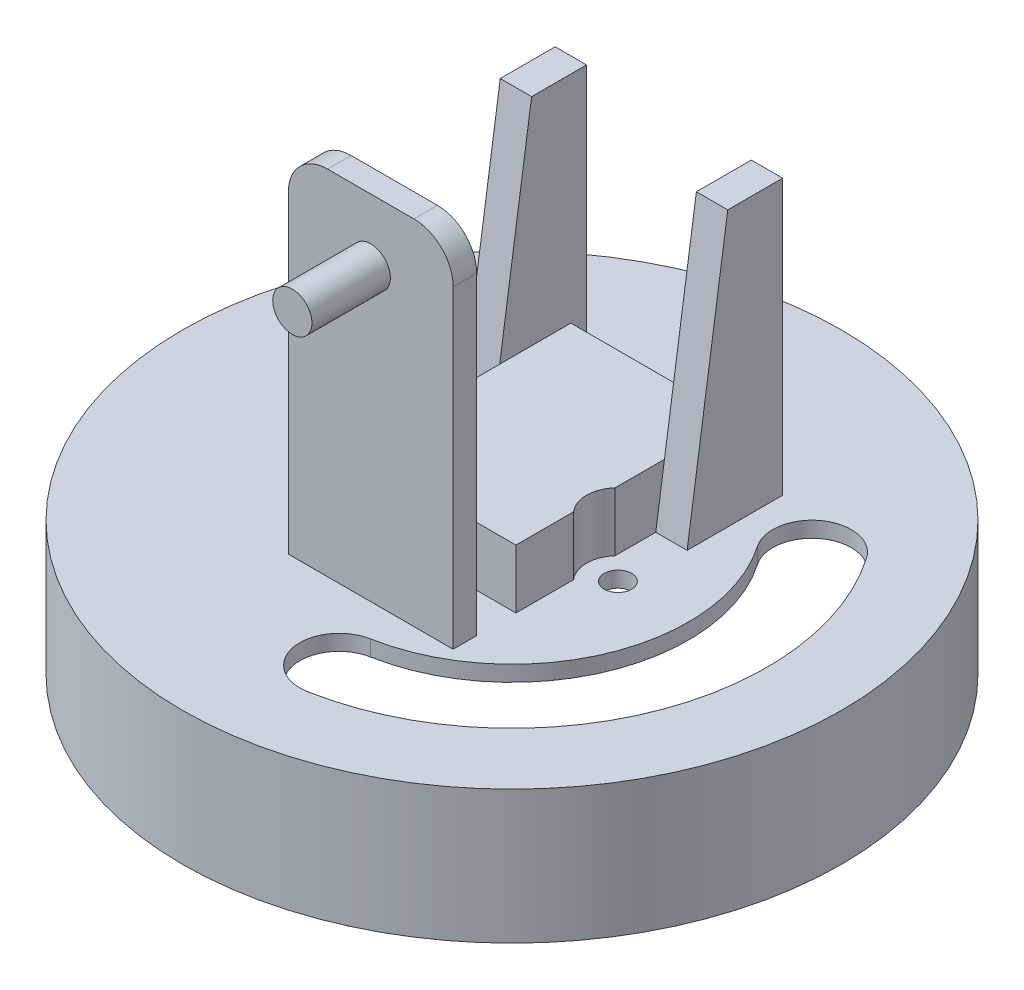
ISO-10303-21;
HEADER;
FILE_DESCRIPTION(('STEP AP214'),'2;1');
FILE_NAME('part.step','',(''),(''),'','','');
FILE_SCHEMA(('AUTOMOTIVE_DESIGN { 1 0 10303 214 1 1 1 1 }'));
ENDSEC;
DATA;
#1=APPLICATION_CONTEXT('core data for automotive mechanical design processes');
#2=APPLICATION_PROTOCOL_DEFINITION('international standard','automotive_design',2000,#1);
#3=PRODUCT_CONTEXT('',#1,'mechanical');
#4=PRODUCT('Part','Part','',(#3));
#5=PRODUCT_RELATED_PRODUCT_CATEGORY('part','',(#4));
#6=PRODUCT_DEFINITION_FORMATION('','',#4);
#7=PRODUCT_DEFINITION_CONTEXT('part definition',#1,'design');
#8=PRODUCT_DEFINITION('design','',#6,#7);
#9=PRODUCT_DEFINITION_SHAPE('','',#8);
#10=(LENGTH_UNIT() NAMED_UNIT(*) SI_UNIT(.MILLI.,.METRE.));
#11=(NAMED_UNIT(*) PLANE_ANGLE_UNIT() SI_UNIT($,.RADIAN.));
#12=(NAMED_UNIT(*) SI_UNIT($,.STERADIAN.) SOLID_ANGLE_UNIT());
#13=UNCERTAINTY_MEASURE_WITH_UNIT(LENGTH_MEASURE(1.E-05),#10,'distance_accuracy_value','');
#14=(GEOMETRIC_REPRESENTATION_CONTEXT(3) GLOBAL_UNCERTAINTY_ASSIGNED_CONTEXT((#13)) GLOBAL_UNIT_ASSIGNED_CONTEXT((#10,
#11,#12)) REPRESENTATION_CONTEXT('',''));
#15=CARTESIAN_POINT('',(0.,0.,0.));
#16=DIRECTION('',(0.,0.,1.));
#17=DIRECTION('',(1.,0.,0.));
#18=AXIS2_PLACEMENT_3D('',#15,#16,#17);
#19=CARTESIAN_POINT('',(0.,17.,0.));
#20=DIRECTION('',(0.,1.,0.));
#21=DIRECTION('',(0.,0.,1.));
#22=AXIS2_PLACEMENT_3D('',#19,#20,#21);
#23=PLANE('',#22);
#24=CARTESIAN_POINT('',(-13.5,17.,0.));
#25=DIRECTION('',(0.,1.,0.));
#26=DIRECTION('',(0.,0.,1.));
#27=AXIS2_PLACEMENT_3D('',#24,#25,#26);
#28=CIRCLE('',#27,1.75);
#29=CARTESIAN_POINT('',(-13.5,17.,1.75));
#30=VERTEX_POINT('',#29);
#31=EDGE_CURVE('E409',#30,#30,#28,.T.);
#32=ORIENTED_EDGE('',*,*,#31,.F.);
#33=EDGE_LOOP('',(#32));
#34=FACE_BOUND('',#33,.T.);
#35=CARTESIAN_POINT('',(13.5,17.,0.));
#36=DIRECTION('',(0.,1.,0.));
#37=DIRECTION('',(0.,0.,1.));
#38=AXIS2_PLACEMENT_3D('',#35,#36,#37);
#39=CIRCLE('',#38,1.75);
#40=CARTESIAN_POINT('',(13.5,17.,1.75));
#41=VERTEX_POINT('',#40);
#42=EDGE_CURVE('E398',#41,#41,#39,.T.);
#43=ORIENTED_EDGE('',*,*,#42,.F.);
#44=EDGE_LOOP('',(#43));
#45=FACE_BOUND('',#44,.T.);
#46=CARTESIAN_POINT('',(0.,17.,0.));
#47=DIRECTION('',(0.,1.,0.));
#48=DIRECTION('',(0.,0.,1.));
#49=AXIS2_PLACEMENT_3D('',#46,#47,#48);
#50=CIRCLE('',#49,42.);
#51=CARTESIAN_POINT('',(0.,17.,42.));
#52=VERTEX_POINT('',#51);
#53=EDGE_CURVE('E408',#52,#52,#50,.T.);
#54=ORIENTED_EDGE('',*,*,#53,.T.);
#55=EDGE_LOOP('',(#54));
#56=FACE_BOUND('',#55,.T.);
#57=CARTESIAN_POINT('',(0.,17.,0.));
#58=DIRECTION('',(0.,1.,0.));
#59=DIRECTION('',(0.,0.,1.));
#60=AXIS2_PLACEMENT_3D('',#57,#58,#59);
#61=CIRCLE('',#60,22.5);
#62=CARTESIAN_POINT('',(4.09090909090909,17.,22.1249737358017));
#63=VERTEX_POINT('',#62);
#64=CARTESIAN_POINT('',(18.5374285215592,17.,-12.7520094027602));
#65=VERTEX_POINT('',#64);
#66=EDGE_CURVE('E388',#63,#65,#61,.T.);
#67=ORIENTED_EDGE('',*,*,#66,.T.);
#68=CARTESIAN_POINT('',(22.6568570819057,17.,-15.5857892700402));
#69=DIRECTION('',(0.,1.,0.));
#70=DIRECTION('',(0.,0.,1.));
#71=AXIS2_PLACEMENT_3D('',#68,#69,#70);
#72=CIRCLE('',#71,5.);
#73=CARTESIAN_POINT('',(26.7762856422522,17.,-18.4195691373203));
#74=VERTEX_POINT('',#73);
#75=EDGE_CURVE('E373',#65,#74,#72,.F.);
#76=ORIENTED_EDGE('',*,*,#75,.T.);
#77=CARTESIAN_POINT('',(0.,17.,0.));
#78=DIRECTION('',(0.,1.,0.));
#79=DIRECTION('',(0.,0.,1.));
#80=AXIS2_PLACEMENT_3D('',#77,#78,#79);
#81=CIRCLE('',#80,32.5);
#82=CARTESIAN_POINT('',(5.90909090909091,17.,31.9582953961581));
#83=VERTEX_POINT('',#82);
#84=EDGE_CURVE('E377',#83,#74,#81,.T.);
#85=ORIENTED_EDGE('',*,*,#84,.F.);
#86=CARTESIAN_POINT('',(5.,17.,27.0416345659799));
#87=DIRECTION('',(0.,1.,0.));
#88=DIRECTION('',(0.,0.,1.));
#89=AXIS2_PLACEMENT_3D('',#86,#87,#88);
#90=CIRCLE('',#89,5.);
#91=EDGE_CURVE('E391',#83,#63,#90,.F.);
#92=ORIENTED_EDGE('',*,*,#91,.T.);
#93=EDGE_LOOP('',(#67,#76,#85,#92));
#94=FACE_BOUND('',#93,.T.);
#95=DIRECTION('',(0.,0.,1.));
#96=VECTOR('',#95,1.);
#97=CARTESIAN_POINT('',(-10.5,17.,-2.64575131106459));
#98=LINE('',#97,#96);
#99=CARTESIAN_POINT('',(-10.5,17.,-7.8228756555323));
#100=VERTEX_POINT('',#99);
#101=CARTESIAN_POINT('',(-10.5,17.,-2.64575131106459));
#102=VERTEX_POINT('',#101);
#103=EDGE_CURVE('E345',#100,#102,#98,.T.);
#104=ORIENTED_EDGE('',*,*,#103,.F.);
#105=DIRECTION('',(1.,0.,0.));
#106=VECTOR('',#105,1.);
#107=CARTESIAN_POINT('',(-14.5,17.,-7.8228756555323));
#108=LINE('',#107,#106);
#109=CARTESIAN_POINT('',(-14.5,17.,-7.8228756555323));
#110=VERTEX_POINT('',#109);
#111=EDGE_CURVE('E250',#110,#100,#108,.T.);
#112=ORIENTED_EDGE('',*,*,#111,.F.);
#113=DIRECTION('',(0.,0.,1.));
#114=VECTOR('',#113,1.);
#115=CARTESIAN_POINT('',(-14.5,17.,-13.));
#116=LINE('',#115,#114);
#117=CARTESIAN_POINT('',(-14.5,17.,-20.));
#118=VERTEX_POINT('',#117);
#119=EDGE_CURVE('E303',#118,#110,#116,.T.);
#120=ORIENTED_EDGE('',*,*,#119,.F.);
#121=DIRECTION('',(-1.,0.,0.));
#122=VECTOR('',#121,1.);
#123=CARTESIAN_POINT('',(-14.5,17.,-20.));
#124=LINE('',#123,#122);
#125=CARTESIAN_POINT('',(-10.5,17.,-20.));
#126=VERTEX_POINT('',#125);
#127=EDGE_CURVE('E288',#126,#118,#124,.T.);
#128=ORIENTED_EDGE('',*,*,#127,.F.);
#129=DIRECTION('',(0.,0.,-1.));
#130=VECTOR('',#129,1.);
#131=CARTESIAN_POINT('',(-10.5,17.,-18.));
#132=LINE('',#131,#130);
#133=CARTESIAN_POINT('',(-10.5,17.,-18.));
#134=VERTEX_POINT('',#133);
#135=EDGE_CURVE('E293',#134,#126,#132,.T.);
#136=ORIENTED_EDGE('',*,*,#135,.F.);
#137=DIRECTION('',(-1.,0.,0.));
#138=VECTOR('',#137,1.);
#139=CARTESIAN_POINT('',(-10.5,17.,-18.));
#140=LINE('',#139,#138);
#141=CARTESIAN_POINT('',(10.5,17.,-18.));
#142=VERTEX_POINT('',#141);
#143=EDGE_CURVE('E342',#142,#134,#140,.T.);
#144=ORIENTED_EDGE('',*,*,#143,.F.);
#145=DIRECTION('',(0.,0.,1.));
#146=VECTOR('',#145,1.);
#147=CARTESIAN_POINT('',(10.5,17.,-18.));
#148=LINE('',#147,#146);
#149=CARTESIAN_POINT('',(10.5,17.,-20.));
#150=VERTEX_POINT('',#149);
#151=EDGE_CURVE('E281',#150,#142,#148,.T.);
#152=ORIENTED_EDGE('',*,*,#151,.F.);
#153=DIRECTION('',(-1.,0.,0.));
#154=VECTOR('',#153,1.);
#155=CARTESIAN_POINT('',(14.5,17.,-20.));
#156=LINE('',#155,#154);
#157=CARTESIAN_POINT('',(14.5,17.,-20.));
#158=VERTEX_POINT('',#157);
#159=EDGE_CURVE('E265',#158,#150,#156,.T.);
#160=ORIENTED_EDGE('',*,*,#159,.F.);
#161=DIRECTION('',(0.,0.,-1.));
#162=VECTOR('',#161,1.);
#163=CARTESIAN_POINT('',(14.5,17.,-13.));
#164=LINE('',#163,#162);
#165=CARTESIAN_POINT('',(14.5,17.,-7.82287565553231));
#166=VERTEX_POINT('',#165);
#167=EDGE_CURVE('E270',#166,#158,#164,.T.);
#168=ORIENTED_EDGE('',*,*,#167,.F.);
#169=DIRECTION('',(-1.,0.,0.));
#170=VECTOR('',#169,1.);
#171=CARTESIAN_POINT('',(14.5,17.,-7.82287565553231));
#172=LINE('',#171,#170);
#173=CARTESIAN_POINT('',(10.5,17.,-7.82287565553231));
#174=VERTEX_POINT('',#173);
#175=EDGE_CURVE('E259',#166,#174,#172,.T.);
#176=ORIENTED_EDGE('',*,*,#175,.T.);
#177=DIRECTION('',(0.,0.,-1.));
#178=VECTOR('',#177,1.);
#179=CARTESIAN_POINT('',(10.5,17.,-18.));
#180=LINE('',#179,#178);
#181=CARTESIAN_POINT('',(10.5,17.,-2.64575131106459));
#182=VERTEX_POINT('',#181);
#183=EDGE_CURVE('E339',#182,#174,#180,.T.);
#184=ORIENTED_EDGE('',*,*,#183,.F.);
#185=CARTESIAN_POINT('',(13.5,17.,0.));
#186=DIRECTION('',(0.,-1.,0.));
#187=DIRECTION('',(0.,0.,1.));
#188=AXIS2_PLACEMENT_3D('',#185,#186,#187);
#189=CIRCLE('',#188,4.);
#190=CARTESIAN_POINT('',(10.5,17.,2.64575131106459));
#191=VERTEX_POINT('',#190);
#192=EDGE_CURVE('E337',#191,#182,#189,.T.);
#193=ORIENTED_EDGE('',*,*,#192,.F.);
#194=DIRECTION('',(0.,0.,-1.));
#195=VECTOR('',#194,1.);
#196=CARTESIAN_POINT('',(10.5,17.,2.64575131106459));
#197=LINE('',#196,#195);
#198=CARTESIAN_POINT('',(10.5,17.,10.));
#199=VERTEX_POINT('',#198);
#200=EDGE_CURVE('E311',#199,#191,#197,.T.);
#201=ORIENTED_EDGE('',*,*,#200,.F.);
#202=DIRECTION('',(1.,0.,0.));
#203=VECTOR('',#202,1.);
#204=CARTESIAN_POINT('',(-10.5,17.,10.));
#205=LINE('',#204,#203);
#206=CARTESIAN_POINT('',(-10.5,17.,10.));
#207=VERTEX_POINT('',#206);
#208=EDGE_CURVE('E316',#207,#199,#205,.T.);
#209=ORIENTED_EDGE('',*,*,#208,.F.);
#210=DIRECTION('',(0.,0.,1.));
#211=VECTOR('',#210,1.);
#212=CARTESIAN_POINT('',(-10.5,17.,10.));
#213=LINE('',#212,#211);
#214=CARTESIAN_POINT('',(-10.5,17.,2.64575131106459));
#215=VERTEX_POINT('',#214);
#216=EDGE_CURVE('E349',#215,#207,#213,.T.);
#217=ORIENTED_EDGE('',*,*,#216,.F.);
#218=CARTESIAN_POINT('',(-13.5,17.,0.));
#219=DIRECTION('',(0.,-1.,0.));
#220=DIRECTION('',(0.,0.,1.));
#221=AXIS2_PLACEMENT_3D('',#218,#219,#220);
#222=CIRCLE('',#221,4.);
#223=EDGE_CURVE('E347',#102,#215,#222,.T.);
#224=ORIENTED_EDGE('',*,*,#223,.F.);
#225=EDGE_LOOP('',(#104,#112,#120,#128,#136,#144,#152,#160,#168,#176,#184,#193,#201,#209,#217,#224));
#226=FACE_BOUND('',#225,.T.);
#227=DIRECTION('',(0.,0.,1.));
#228=VECTOR('',#227,1.);
#229=CARTESIAN_POINT('',(-10.5,17.,18.));
#230=LINE('',#229,#228);
#231=CARTESIAN_POINT('',(-10.5,17.,15.));
#232=VERTEX_POINT('',#231);
#233=CARTESIAN_POINT('',(-10.5,17.,18.));
#234=VERTEX_POINT('',#233);
#235=EDGE_CURVE('E216',#232,#234,#230,.T.);
#236=ORIENTED_EDGE('',*,*,#235,.F.);
#237=DIRECTION('',(-1.,0.,0.));
#238=VECTOR('',#237,1.);
#239=CARTESIAN_POINT('',(-10.5,17.,15.));
#240=LINE('',#239,#238);
#241=CARTESIAN_POINT('',(10.5,17.,15.));
#242=VERTEX_POINT('',#241);
#243=EDGE_CURVE('E225',#242,#232,#240,.T.);
#244=ORIENTED_EDGE('',*,*,#243,.F.);
#245=DIRECTION('',(0.,0.,-1.));
#246=VECTOR('',#245,1.);
#247=CARTESIAN_POINT('',(10.5,17.,15.));
#248=LINE('',#247,#246);
#249=CARTESIAN_POINT('',(10.5,17.,18.));
#250=VERTEX_POINT('',#249);
#251=EDGE_CURVE('E237',#250,#242,#248,.T.);
#252=ORIENTED_EDGE('',*,*,#251,.F.);
#253=DIRECTION('',(1.,0.,0.));
#254=VECTOR('',#253,1.);
#255=CARTESIAN_POINT('',(10.5,17.,18.));
#256=LINE('',#255,#254);
#257=EDGE_CURVE('E235',#234,#250,#256,.T.);
#258=ORIENTED_EDGE('',*,*,#257,.F.);
#259=EDGE_LOOP('',(#236,#244,#252,#258));
#260=FACE_BOUND('',#259,.T.);
#261=ADVANCED_FACE('F33',(#34,#45,#56,#94,#226,#260),#23,.T.);
#262=CARTESIAN_POINT('',(-10.5,24.5,-2.64575131106459));
#263=DIRECTION('',(1.,0.,0.));
#264=DIRECTION('',(0.,0.,-1.));
#265=AXIS2_PLACEMENT_3D('',#262,#263,#264);
#266=PLANE('',#265);
#267=DIRECTION('',(0.,0.989236465050933,-0.14632571959001));
#268=VECTOR('',#267,1.);
#269=CARTESIAN_POINT('',(-10.5,52.,-13.));
#270=LINE('',#269,#268);
#271=CARTESIAN_POINT('',(-10.5,24.5,-8.93225944363252));
#272=VERTEX_POINT('',#271);
#273=EDGE_CURVE('E251',#100,#272,#270,.T.);
#274=ORIENTED_EDGE('',*,*,#273,.F.);
#275=ORIENTED_EDGE('',*,*,#103,.T.);
#276=DIRECTION('',(0.,-1.,0.));
#277=VECTOR('',#276,1.);
#278=CARTESIAN_POINT('',(-10.5,24.5,-2.64575131106459));
#279=LINE('',#278,#277);
#280=CARTESIAN_POINT('',(-10.5,24.5,-2.64575131106459));
#281=VERTEX_POINT('',#280);
#282=EDGE_CURVE('E360',#281,#102,#279,.T.);
#283=ORIENTED_EDGE('',*,*,#282,.F.);
#284=DIRECTION('',(0.,0.,1.));
#285=VECTOR('',#284,1.);
#286=CARTESIAN_POINT('',(-10.5,24.5,-2.64575131106459));
#287=LINE('',#286,#285);
#288=EDGE_CURVE('E325',#272,#281,#287,.T.);
#289=ORIENTED_EDGE('',*,*,#288,.F.);
#290=EDGE_LOOP('',(#274,#275,#283,#289));
#291=FACE_BOUND('',#290,.T.);
#292=ADVANCED_FACE('F476',(#291),#266,.F.);
#293=CARTESIAN_POINT('',(10.5,24.5,-18.));
#294=DIRECTION('',(-1.,0.,0.));
#295=DIRECTION('',(0.,0.,1.));
#296=AXIS2_PLACEMENT_3D('',#293,#294,#295);
#297=PLANE('',#296);
#298=DIRECTION('',(0.,-0.989236465050933,0.146325719590011));
#299=VECTOR('',#298,1.);
#300=CARTESIAN_POINT('',(10.5,52.,-13.));
#301=LINE('',#300,#299);
#302=CARTESIAN_POINT('',(10.5,24.5,-8.93225944363254));
#303=VERTEX_POINT('',#302);
#304=EDGE_CURVE('E255',#303,#174,#301,.T.);
#305=ORIENTED_EDGE('',*,*,#304,.F.);
#306=DIRECTION('',(0.,0.,-1.));
#307=VECTOR('',#306,1.);
#308=CARTESIAN_POINT('',(10.5,24.5,-18.));
#309=LINE('',#308,#307);
#310=CARTESIAN_POINT('',(10.5,24.5,-2.64575131106459));
#311=VERTEX_POINT('',#310);
#312=EDGE_CURVE('E319',#311,#303,#309,.T.);
#313=ORIENTED_EDGE('',*,*,#312,.F.);
#314=DIRECTION('',(0.,-1.,0.));
#315=VECTOR('',#314,1.);
#316=CARTESIAN_POINT('',(10.5,24.5,-2.64575131106459));
#317=LINE('',#316,#315);
#318=EDGE_CURVE('E368',#311,#182,#317,.T.);
#319=ORIENTED_EDGE('',*,*,#318,.T.);
#320=ORIENTED_EDGE('',*,*,#183,.T.);
#321=EDGE_LOOP('',(#305,#313,#319,#320));
#322=FACE_BOUND('',#321,.T.);
#323=ADVANCED_FACE('F484',(#322),#297,.F.);
#324=CARTESIAN_POINT('',(0.,15.,0.));
#325=DIRECTION('',(0.,1.,0.));
#326=DIRECTION('',(0.,0.,1.));
#327=AXIS2_PLACEMENT_3D('',#324,#325,#326);
#328=PLANE('',#327);
#329=CARTESIAN_POINT('',(0.,15.,0.));
#330=DIRECTION('',(0.,1.,0.));
#331=DIRECTION('',(0.,0.,1.));
#332=AXIS2_PLACEMENT_3D('',#329,#330,#331);
#333=CIRCLE('',#332,40.);
#334=CARTESIAN_POINT('',(0.,15.,40.));
#335=VERTEX_POINT('',#334);
#336=EDGE_CURVE('E419',#335,#335,#333,.T.);
#337=ORIENTED_EDGE('',*,*,#336,.F.);
#338=EDGE_LOOP('',(#337));
#339=FACE_BOUND('',#338,.T.);
#340=CARTESIAN_POINT('',(13.5,15.,0.));
#341=DIRECTION('',(0.,1.,0.));
#342=DIRECTION('',(0.,0.,1.));
#343=AXIS2_PLACEMENT_3D('',#340,#341,#342);
#344=CIRCLE('',#343,1.75);
#345=CARTESIAN_POINT('',(13.5,15.,1.75));
#346=VERTEX_POINT('',#345);
#347=EDGE_CURVE('E412',#346,#346,#344,.T.);
#348=ORIENTED_EDGE('',*,*,#347,.T.);
#349=EDGE_LOOP('',(#348));
#350=FACE_BOUND('',#349,.T.);
#351=CARTESIAN_POINT('',(-13.5,15.,0.));
#352=DIRECTION('',(0.,1.,0.));
#353=DIRECTION('',(0.,0.,1.));
#354=AXIS2_PLACEMENT_3D('',#351,#352,#353);
#355=CIRCLE('',#354,1.75);
#356=CARTESIAN_POINT('',(-13.5,15.,1.75));
#357=VERTEX_POINT('',#356);
#358=EDGE_CURVE('E405',#357,#357,#355,.T.);
#359=ORIENTED_EDGE('',*,*,#358,.T.);
#360=EDGE_LOOP('',(#359));
#361=FACE_BOUND('',#360,.T.);
#362=CARTESIAN_POINT('',(22.6568570819057,15.,-15.5857892700402));
#363=DIRECTION('',(0.,1.,0.));
#364=DIRECTION('',(0.,0.,1.));
#365=AXIS2_PLACEMENT_3D('',#362,#363,#364);
#366=CIRCLE('',#365,5.);
#367=CARTESIAN_POINT('',(18.5374285215592,15.,-12.7520094027602));
#368=VERTEX_POINT('',#367);
#369=CARTESIAN_POINT('',(26.7762856422522,15.,-18.4195691373203));
#370=VERTEX_POINT('',#369);
#371=EDGE_CURVE('E374',#368,#370,#366,.F.);
#372=ORIENTED_EDGE('',*,*,#371,.F.);
#373=CARTESIAN_POINT('',(0.,15.,0.));
#374=DIRECTION('',(0.,1.,0.));
#375=DIRECTION('',(0.,0.,1.));
#376=AXIS2_PLACEMENT_3D('',#373,#374,#375);
#377=CIRCLE('',#376,22.5);
#378=CARTESIAN_POINT('',(4.09090909090909,15.,22.1249737358017));
#379=VERTEX_POINT('',#378);
#380=EDGE_CURVE('E376',#379,#368,#377,.T.);
#381=ORIENTED_EDGE('',*,*,#380,.F.);
#382=CARTESIAN_POINT('',(5.,15.,27.0416345659799));
#383=DIRECTION('',(0.,1.,0.));
#384=DIRECTION('',(0.,0.,1.));
#385=AXIS2_PLACEMENT_3D('',#382,#383,#384);
#386=CIRCLE('',#385,5.);
#387=CARTESIAN_POINT('',(5.90909090909091,15.,31.9582953961581));
#388=VERTEX_POINT('',#387);
#389=EDGE_CURVE('E379',#388,#379,#386,.F.);
#390=ORIENTED_EDGE('',*,*,#389,.F.);
#391=CARTESIAN_POINT('',(0.,15.,0.));
#392=DIRECTION('',(0.,1.,0.));
#393=DIRECTION('',(0.,0.,1.));
#394=AXIS2_PLACEMENT_3D('',#391,#392,#393);
#395=CIRCLE('',#394,32.5);
#396=EDGE_CURVE('E382',#388,#370,#395,.T.);
#397=ORIENTED_EDGE('',*,*,#396,.T.);
#398=EDGE_LOOP('',(#372,#381,#390,#397));
#399=FACE_BOUND('',#398,.T.);
#400=ADVANCED_FACE('F493',(#339,#350,#361,#399),#328,.F.);
#401=CARTESIAN_POINT('',(0.,0.,0.));
#402=DIRECTION('',(0.,1.,0.));
#403=DIRECTION('',(0.,0.,1.));
#404=AXIS2_PLACEMENT_3D('',#401,#402,#403);
#405=PLANE('',#404);
#406=CARTESIAN_POINT('',(0.,0.,0.));
#407=DIRECTION('',(0.,1.,0.));
#408=DIRECTION('',(0.,0.,1.));
#409=AXIS2_PLACEMENT_3D('',#406,#407,#408);
#410=CIRCLE('',#409,42.);
#411=CARTESIAN_POINT('',(0.,0.,42.));
#412=VERTEX_POINT('',#411);
#413=EDGE_CURVE('E425',#412,#412,#410,.T.);
#414=ORIENTED_EDGE('',*,*,#413,.F.);
#415=EDGE_LOOP('',(#414));
#416=FACE_BOUND('',#415,.T.);
#417=CARTESIAN_POINT('',(0.,0.,0.));
#418=DIRECTION('',(0.,1.,0.));
#419=DIRECTION('',(0.,0.,1.));
#420=AXIS2_PLACEMENT_3D('',#417,#418,#419);
#421=CIRCLE('',#420,40.);
#422=CARTESIAN_POINT('',(0.,0.,40.));
#423=VERTEX_POINT('',#422);
#424=EDGE_CURVE('E422',#423,#423,#421,.T.);
#425=ORIENTED_EDGE('',*,*,#424,.T.);
#426=EDGE_LOOP('',(#425));
#427=FACE_BOUND('',#426,.T.);
#428=ADVANCED_FACE('F496',(#416,#427),#405,.F.);
#429=CARTESIAN_POINT('',(0.,15.,0.));
#430=DIRECTION('',(0.,-1.,0.));
#431=DIRECTION('',(0.,0.,-1.));
#432=AXIS2_PLACEMENT_3D('',#429,#430,#431);
#433=CYLINDRICAL_SURFACE('',#432,42.);
#434=ORIENTED_EDGE('',*,*,#413,.T.);
#435=EDGE_LOOP('',(#434));
#436=FACE_BOUND('',#435,.T.);
#437=ORIENTED_EDGE('',*,*,#53,.F.);
#438=EDGE_LOOP('',(#437));
#439=FACE_BOUND('',#438,.T.);
#440=ADVANCED_FACE('F501',(#436,#439),#433,.T.);
#441=CARTESIAN_POINT('',(0.,15.,0.));
#442=DIRECTION('',(0.,-1.,0.));
#443=DIRECTION('',(0.,0.,-1.));
#444=AXIS2_PLACEMENT_3D('',#441,#442,#443);
#445=CYLINDRICAL_SURFACE('',#444,40.);
#446=ORIENTED_EDGE('',*,*,#336,.T.);
#447=EDGE_LOOP('',(#446));
#448=FACE_BOUND('',#447,.T.);
#449=ORIENTED_EDGE('',*,*,#424,.F.);
#450=EDGE_LOOP('',(#449));
#451=FACE_BOUND('',#450,.T.);
#452=ADVANCED_FACE('F498',(#448,#451),#445,.F.);
#453=CARTESIAN_POINT('',(13.5,15.,0.));
#454=DIRECTION('',(0.,1.,0.));
#455=DIRECTION('',(0.,0.,1.));
#456=AXIS2_PLACEMENT_3D('',#453,#454,#455);
#457=CYLINDRICAL_SURFACE('',#456,1.75);
#458=ORIENTED_EDGE('',*,*,#347,.F.);
#459=EDGE_LOOP('',(#458));
#460=FACE_BOUND('',#459,.T.);
#461=ORIENTED_EDGE('',*,*,#42,.T.);
#462=EDGE_LOOP('',(#461));
#463=FACE_BOUND('',#462,.T.);
#464=ADVANCED_FACE('F491',(#460,#463),#457,.F.);
#465=CARTESIAN_POINT('',(-13.5,15.,0.));
#466=DIRECTION('',(0.,1.,0.));
#467=DIRECTION('',(0.,0.,1.));
#468=AXIS2_PLACEMENT_3D('',#465,#466,#467);
#469=CYLINDRICAL_SURFACE('',#468,1.75);
#470=ORIENTED_EDGE('',*,*,#358,.F.);
#471=EDGE_LOOP('',(#470));
#472=FACE_BOUND('',#471,.T.);
#473=ORIENTED_EDGE('',*,*,#31,.T.);
#474=EDGE_LOOP('',(#473));
#475=FACE_BOUND('',#474,.T.);
#476=ADVANCED_FACE('F728',(#472,#475),#469,.F.);
#477=CARTESIAN_POINT('',(22.6568570819057,15.,-15.5857892700402));
#478=DIRECTION('',(0.,1.,0.));
#479=DIRECTION('',(0.,0.,1.));
#480=AXIS2_PLACEMENT_3D('',#477,#478,#479);
#481=CYLINDRICAL_SURFACE('',#480,5.);
#482=ORIENTED_EDGE('',*,*,#75,.F.);
#483=DIRECTION('',(0.,1.,0.));
#484=VECTOR('',#483,1.);
#485=CARTESIAN_POINT('',(18.5374285215592,15.,-12.7520094027602));
#486=LINE('',#485,#484);
#487=EDGE_CURVE('E385',#368,#65,#486,.T.);
#488=ORIENTED_EDGE('',*,*,#487,.F.);
#489=ORIENTED_EDGE('',*,*,#371,.T.);
#490=DIRECTION('',(0.,1.,0.));
#491=VECTOR('',#490,1.);
#492=CARTESIAN_POINT('',(26.7762856422522,15.,-18.4195691373203));
#493=LINE('',#492,#491);
#494=EDGE_CURVE('E396',#370,#74,#493,.T.);
#495=ORIENTED_EDGE('',*,*,#494,.T.);
#496=EDGE_LOOP('',(#482,#488,#489,#495));
#497=FACE_BOUND('',#496,.T.);
#498=ADVANCED_FACE('F720',(#497),#481,.F.);
#499=CARTESIAN_POINT('',(0.,15.,0.));
#500=DIRECTION('',(0.,1.,0.));
#501=DIRECTION('',(0.,0.,1.));
#502=AXIS2_PLACEMENT_3D('',#499,#500,#501);
#503=CYLINDRICAL_SURFACE('',#502,32.5);
#504=ORIENTED_EDGE('',*,*,#84,.T.);
#505=ORIENTED_EDGE('',*,*,#494,.F.);
#506=ORIENTED_EDGE('',*,*,#396,.F.);
#507=DIRECTION('',(0.,1.,0.));
#508=VECTOR('',#507,1.);
#509=CARTESIAN_POINT('',(5.90909090909091,15.,31.9582953961581));
#510=LINE('',#509,#508);
#511=EDGE_CURVE('E399',#388,#83,#510,.T.);
#512=ORIENTED_EDGE('',*,*,#511,.T.);
#513=EDGE_LOOP('',(#504,#505,#506,#512));
#514=FACE_BOUND('',#513,.T.);
#515=ADVANCED_FACE('F712',(#514),#503,.F.);
#516=CARTESIAN_POINT('',(5.,15.,27.0416345659799));
#517=DIRECTION('',(0.,1.,0.));
#518=DIRECTION('',(0.,0.,1.));
#519=AXIS2_PLACEMENT_3D('',#516,#517,#518);
#520=CYLINDRICAL_SURFACE('',#519,5.);
#521=ORIENTED_EDGE('',*,*,#91,.F.);
#522=ORIENTED_EDGE('',*,*,#511,.F.);
#523=ORIENTED_EDGE('',*,*,#389,.T.);
#524=DIRECTION('',(0.,1.,0.));
#525=VECTOR('',#524,1.);
#526=CARTESIAN_POINT('',(4.09090909090909,15.,22.1249737358017));
#527=LINE('',#526,#525);
#528=EDGE_CURVE('E401',#379,#63,#527,.T.);
#529=ORIENTED_EDGE('',*,*,#528,.T.);
#530=EDGE_LOOP('',(#521,#522,#523,#529));
#531=FACE_BOUND('',#530,.T.);
#532=ADVANCED_FACE('F704',(#531),#520,.F.);
#533=CARTESIAN_POINT('',(0.,15.,0.));
#534=DIRECTION('',(0.,1.,0.));
#535=DIRECTION('',(0.,0.,1.));
#536=AXIS2_PLACEMENT_3D('',#533,#534,#535);
#537=CYLINDRICAL_SURFACE('',#536,22.5);
#538=ORIENTED_EDGE('',*,*,#66,.F.);
#539=ORIENTED_EDGE('',*,*,#528,.F.);
#540=ORIENTED_EDGE('',*,*,#380,.T.);
#541=ORIENTED_EDGE('',*,*,#487,.T.);
#542=EDGE_LOOP('',(#538,#539,#540,#541));
#543=FACE_BOUND('',#542,.T.);
#544=ADVANCED_FACE('F696',(#543),#537,.T.);
#545=CARTESIAN_POINT('',(10.5,24.5,2.64575131106459));
#546=DIRECTION('',(-1.,0.,0.));
#547=DIRECTION('',(0.,0.,1.));
#548=AXIS2_PLACEMENT_3D('',#545,#546,#547);
#549=PLANE('',#548);
#550=ORIENTED_EDGE('',*,*,#200,.T.);
#551=DIRECTION('',(0.,-1.,0.));
#552=VECTOR('',#551,1.);
#553=CARTESIAN_POINT('',(10.5,24.5,2.64575131106459));
#554=LINE('',#553,#552);
#555=CARTESIAN_POINT('',(10.5,24.5,2.64575131106459));
#556=VERTEX_POINT('',#555);
#557=EDGE_CURVE('E371',#556,#191,#554,.T.);
#558=ORIENTED_EDGE('',*,*,#557,.F.);
#559=DIRECTION('',(0.,0.,-1.));
#560=VECTOR('',#559,1.);
#561=CARTESIAN_POINT('',(10.5,24.5,2.64575131106459));
#562=LINE('',#561,#560);
#563=CARTESIAN_POINT('',(10.5,24.5,10.));
#564=VERTEX_POINT('',#563);
#565=EDGE_CURVE('E312',#564,#556,#562,.T.);
#566=ORIENTED_EDGE('',*,*,#565,.F.);
#567=DIRECTION('',(0.,-1.,0.));
#568=VECTOR('',#567,1.);
#569=CARTESIAN_POINT('',(10.5,24.5,10.));
#570=LINE('',#569,#568);
#571=EDGE_CURVE('E334',#564,#199,#570,.T.);
#572=ORIENTED_EDGE('',*,*,#571,.T.);
#573=EDGE_LOOP('',(#550,#558,#566,#572));
#574=FACE_BOUND('',#573,.T.);
#575=ADVANCED_FACE('F688',(#574),#549,.F.);
#576=CARTESIAN_POINT('',(13.5,24.5,0.));
#577=DIRECTION('',(0.,-1.,0.));
#578=DIRECTION('',(0.,0.,-1.));
#579=AXIS2_PLACEMENT_3D('',#576,#577,#578);
#580=CYLINDRICAL_SURFACE('',#579,4.);
#581=ORIENTED_EDGE('',*,*,#192,.T.);
#582=ORIENTED_EDGE('',*,*,#318,.F.);
#583=CARTESIAN_POINT('',(13.5,24.5,0.));
#584=DIRECTION('',(0.,-1.,0.));
#585=DIRECTION('',(0.,0.,1.));
#586=AXIS2_PLACEMENT_3D('',#583,#584,#585);
#587=CIRCLE('',#586,4.);
#588=EDGE_CURVE('E315',#556,#311,#587,.T.);
#589=ORIENTED_EDGE('',*,*,#588,.F.);
#590=ORIENTED_EDGE('',*,*,#557,.T.);
#591=EDGE_LOOP('',(#581,#582,#589,#590));
#592=FACE_BOUND('',#591,.T.);
#593=ADVANCED_FACE('F681',(#592),#580,.F.);
#594=CARTESIAN_POINT('',(-10.5,24.5,-18.));
#595=DIRECTION('',(0.,0.,1.));
#596=DIRECTION('',(1.,0.,0.));
#597=AXIS2_PLACEMENT_3D('',#594,#595,#596);
#598=PLANE('',#597);
#599=ORIENTED_EDGE('',*,*,#143,.T.);
#600=DIRECTION('',(0.,-1.,0.));
#601=VECTOR('',#600,1.);
#602=CARTESIAN_POINT('',(-10.5,24.5,-18.));
#603=LINE('',#602,#601);
#604=CARTESIAN_POINT('',(-10.5,24.5,-18.));
#605=VERTEX_POINT('',#604);
#606=EDGE_CURVE('E363',#605,#134,#603,.T.);
#607=ORIENTED_EDGE('',*,*,#606,.F.);
#608=DIRECTION('',(-1.,0.,0.));
#609=VECTOR('',#608,1.);
#610=CARTESIAN_POINT('',(-10.5,24.5,-18.));
#611=LINE('',#610,#609);
#612=CARTESIAN_POINT('',(10.5,24.5,-18.));
#613=VERTEX_POINT('',#612);
#614=EDGE_CURVE('E322',#613,#605,#611,.T.);
#615=ORIENTED_EDGE('',*,*,#614,.F.);
#616=DIRECTION('',(0.,-1.,0.));
#617=VECTOR('',#616,1.);
#618=CARTESIAN_POINT('',(10.5,24.5,-18.));
#619=LINE('',#618,#617);
#620=EDGE_CURVE('E365',#613,#142,#619,.T.);
#621=ORIENTED_EDGE('',*,*,#620,.T.);
#622=EDGE_LOOP('',(#599,#607,#615,#621));
#623=FACE_BOUND('',#622,.T.);
#624=ADVANCED_FACE('F673',(#623),#598,.F.);
#625=CARTESIAN_POINT('',(-13.5,24.5,0.));
#626=DIRECTION('',(0.,-1.,0.));
#627=DIRECTION('',(0.,0.,-1.));
#628=AXIS2_PLACEMENT_3D('',#625,#626,#627);
#629=CYLINDRICAL_SURFACE('',#628,4.);
#630=ORIENTED_EDGE('',*,*,#223,.T.);
#631=DIRECTION('',(0.,-1.,0.));
#632=VECTOR('',#631,1.);
#633=CARTESIAN_POINT('',(-10.5,24.5,2.64575131106459));
#634=LINE('',#633,#632);
#635=CARTESIAN_POINT('',(-10.5,24.5,2.64575131106459));
#636=VERTEX_POINT('',#635);
#637=EDGE_CURVE('E357',#636,#215,#634,.T.);
#638=ORIENTED_EDGE('',*,*,#637,.F.);
#639=CARTESIAN_POINT('',(-13.5,24.5,0.));
#640=DIRECTION('',(0.,-1.,0.));
#641=DIRECTION('',(0.,0.,1.));
#642=AXIS2_PLACEMENT_3D('',#639,#640,#641);
#643=CIRCLE('',#642,4.);
#644=EDGE_CURVE('E328',#281,#636,#643,.T.);
#645=ORIENTED_EDGE('',*,*,#644,.F.);
#646=ORIENTED_EDGE('',*,*,#282,.T.);
#647=EDGE_LOOP('',(#630,#638,#645,#646));
#648=FACE_BOUND('',#647,.T.);
#649=ADVANCED_FACE('F665',(#648),#629,.F.);
#650=CARTESIAN_POINT('',(-10.5,24.5,10.));
#651=DIRECTION('',(1.,0.,0.));
#652=DIRECTION('',(0.,0.,-1.));
#653=AXIS2_PLACEMENT_3D('',#650,#651,#652);
#654=PLANE('',#653);
#655=ORIENTED_EDGE('',*,*,#216,.T.);
#656=DIRECTION('',(0.,-1.,0.));
#657=VECTOR('',#656,1.);
#658=CARTESIAN_POINT('',(-10.5,24.5,10.));
#659=LINE('',#658,#657);
#660=CARTESIAN_POINT('',(-10.5,24.5,10.));
#661=VERTEX_POINT('',#660);
#662=EDGE_CURVE('E355',#661,#207,#659,.T.);
#663=ORIENTED_EDGE('',*,*,#662,.F.);
#664=DIRECTION('',(0.,0.,1.));
#665=VECTOR('',#664,1.);
#666=CARTESIAN_POINT('',(-10.5,24.5,10.));
#667=LINE('',#666,#665);
#668=EDGE_CURVE('E330',#636,#661,#667,.T.);
#669=ORIENTED_EDGE('',*,*,#668,.F.);
#670=ORIENTED_EDGE('',*,*,#637,.T.);
#671=EDGE_LOOP('',(#655,#663,#669,#670));
#672=FACE_BOUND('',#671,.T.);
#673=ADVANCED_FACE('F657',(#672),#654,.F.);
#674=CARTESIAN_POINT('',(-10.5,24.5,10.));
#675=DIRECTION('',(0.,0.,-1.));
#676=DIRECTION('',(-1.,0.,0.));
#677=AXIS2_PLACEMENT_3D('',#674,#675,#676);
#678=PLANE('',#677);
#679=ORIENTED_EDGE('',*,*,#208,.T.);
#680=ORIENTED_EDGE('',*,*,#571,.F.);
#681=DIRECTION('',(1.,0.,0.));
#682=VECTOR('',#681,1.);
#683=CARTESIAN_POINT('',(-10.5,24.5,10.));
#684=LINE('',#683,#682);
#685=EDGE_CURVE('E332',#661,#564,#684,.T.);
#686=ORIENTED_EDGE('',*,*,#685,.F.);
#687=ORIENTED_EDGE('',*,*,#662,.T.);
#688=EDGE_LOOP('',(#679,#680,#686,#687));
#689=FACE_BOUND('',#688,.T.);
#690=ADVANCED_FACE('F649',(#689),#678,.F.);
#691=CARTESIAN_POINT('',(-13.5,24.5,0.));
#692=DIRECTION('',(0.,1.,0.));
#693=DIRECTION('',(0.,0.,1.));
#694=AXIS2_PLACEMENT_3D('',#691,#692,#693);
#695=PLANE('',#694);
#696=ORIENTED_EDGE('',*,*,#565,.T.);
#697=ORIENTED_EDGE('',*,*,#588,.T.);
#698=ORIENTED_EDGE('',*,*,#312,.T.);
#699=EDGE_CURVE('E318',#303,#613,#309,.T.);
#700=ORIENTED_EDGE('',*,*,#699,.T.);
#701=ORIENTED_EDGE('',*,*,#614,.T.);
#702=EDGE_CURVE('E326',#605,#272,#287,.T.);
#703=ORIENTED_EDGE('',*,*,#702,.T.);
#704=ORIENTED_EDGE('',*,*,#288,.T.);
#705=ORIENTED_EDGE('',*,*,#644,.T.);
#706=ORIENTED_EDGE('',*,*,#668,.T.);
#707=ORIENTED_EDGE('',*,*,#685,.T.);
#708=EDGE_LOOP('',(#696,#697,#698,#700,#701,#703,#704,#705,#706,#707));
#709=FACE_BOUND('',#708,.T.);
#710=ADVANCED_FACE('F641',(#709),#695,.T.);
#711=CARTESIAN_POINT('',(-10.5,52.,-18.));
#712=DIRECTION('',(-1.,0.,0.));
#713=DIRECTION('',(0.,0.,1.));
#714=AXIS2_PLACEMENT_3D('',#711,#712,#713);
#715=PLANE('',#714);
#716=ORIENTED_EDGE('',*,*,#702,.F.);
#717=ORIENTED_EDGE('',*,*,#606,.T.);
#718=ORIENTED_EDGE('',*,*,#135,.T.);
#719=DIRECTION('',(0.,-1.,0.));
#720=VECTOR('',#719,1.);
#721=CARTESIAN_POINT('',(-10.5,52.,-20.));
#722=LINE('',#721,#720);
#723=CARTESIAN_POINT('',(-10.5,52.,-20.));
#724=VERTEX_POINT('',#723);
#725=EDGE_CURVE('E308',#724,#126,#722,.T.);
#726=ORIENTED_EDGE('',*,*,#725,.F.);
#727=DIRECTION('',(0.,0.,-1.));
#728=VECTOR('',#727,1.);
#729=CARTESIAN_POINT('',(-10.5,52.,-20.));
#730=LINE('',#729,#728);
#731=CARTESIAN_POINT('',(-10.5,52.,-13.));
#732=VERTEX_POINT('',#731);
#733=EDGE_CURVE('E289',#732,#724,#730,.T.);
#734=ORIENTED_EDGE('',*,*,#733,.F.);
#735=EDGE_CURVE('E221',#272,#732,#270,.T.);
#736=ORIENTED_EDGE('',*,*,#735,.F.);
#737=EDGE_LOOP('',(#716,#717,#718,#726,#734,#736));
#738=FACE_BOUND('',#737,.T.);
#739=ADVANCED_FACE('F633',(#738),#715,.F.);
#740=CARTESIAN_POINT('',(-14.5,52.,-20.));
#741=DIRECTION('',(0.,0.,1.));
#742=DIRECTION('',(1.,0.,0.));
#743=AXIS2_PLACEMENT_3D('',#740,#741,#742);
#744=PLANE('',#743);
#745=ORIENTED_EDGE('',*,*,#127,.T.);
#746=DIRECTION('',(0.,-1.,0.));
#747=VECTOR('',#746,1.);
#748=CARTESIAN_POINT('',(-14.5,52.,-20.));
#749=LINE('',#748,#747);
#750=CARTESIAN_POINT('',(-14.5,52.,-20.));
#751=VERTEX_POINT('',#750);
#752=EDGE_CURVE('E301',#751,#118,#749,.T.);
#753=ORIENTED_EDGE('',*,*,#752,.F.);
#754=DIRECTION('',(-1.,0.,0.));
#755=VECTOR('',#754,1.);
#756=CARTESIAN_POINT('',(-14.5,52.,-20.));
#757=LINE('',#756,#755);
#758=EDGE_CURVE('E292',#724,#751,#757,.T.);
#759=ORIENTED_EDGE('',*,*,#758,.F.);
#760=ORIENTED_EDGE('',*,*,#725,.T.);
#761=EDGE_LOOP('',(#745,#753,#759,#760));
#762=FACE_BOUND('',#761,.T.);
#763=ADVANCED_FACE('F625',(#762),#744,.F.);
#764=CARTESIAN_POINT('',(-14.5,52.,-13.));
#765=DIRECTION('',(1.,0.,0.));
#766=DIRECTION('',(0.,0.,-1.));
#767=AXIS2_PLACEMENT_3D('',#764,#765,#766);
#768=PLANE('',#767);
#769=ORIENTED_EDGE('',*,*,#119,.T.);
#770=DIRECTION('',(0.,0.989236465050933,-0.14632571959001));
#771=VECTOR('',#770,1.);
#772=CARTESIAN_POINT('',(-14.5,52.,-13.));
#773=LINE('',#772,#771);
#774=CARTESIAN_POINT('',(-14.5,52.,-13.));
#775=VERTEX_POINT('',#774);
#776=EDGE_CURVE('E248',#110,#775,#773,.T.);
#777=ORIENTED_EDGE('',*,*,#776,.T.);
#778=DIRECTION('',(0.,0.,1.));
#779=VECTOR('',#778,1.);
#780=CARTESIAN_POINT('',(-14.5,52.,-13.));
#781=LINE('',#780,#779);
#782=EDGE_CURVE('E295',#751,#775,#781,.T.);
#783=ORIENTED_EDGE('',*,*,#782,.F.);
#784=ORIENTED_EDGE('',*,*,#752,.T.);
#785=EDGE_LOOP('',(#769,#777,#783,#784));
#786=FACE_BOUND('',#785,.T.);
#787=ADVANCED_FACE('F617',(#786),#768,.F.);
#788=CARTESIAN_POINT('',(0.,52.,0.));
#789=DIRECTION('',(0.,-1.,0.));
#790=DIRECTION('',(0.,0.,-1.));
#791=AXIS2_PLACEMENT_3D('',#788,#789,#790);
#792=PLANE('',#791);
#793=ORIENTED_EDGE('',*,*,#733,.T.);
#794=ORIENTED_EDGE('',*,*,#758,.T.);
#795=ORIENTED_EDGE('',*,*,#782,.T.);
#796=DIRECTION('',(1.,0.,0.));
#797=VECTOR('',#796,1.);
#798=CARTESIAN_POINT('',(-10.5,52.,-13.));
#799=LINE('',#798,#797);
#800=EDGE_CURVE('E298',#775,#732,#799,.T.);
#801=ORIENTED_EDGE('',*,*,#800,.T.);
#802=EDGE_LOOP('',(#793,#794,#795,#801));
#803=FACE_BOUND('',#802,.T.);
#804=ADVANCED_FACE('F610',(#803),#792,.F.);
#805=CARTESIAN_POINT('',(10.5,52.,-18.));
#806=DIRECTION('',(1.,0.,0.));
#807=DIRECTION('',(0.,0.,-1.));
#808=AXIS2_PLACEMENT_3D('',#805,#806,#807);
#809=PLANE('',#808);
#810=ORIENTED_EDGE('',*,*,#151,.T.);
#811=ORIENTED_EDGE('',*,*,#620,.F.);
#812=ORIENTED_EDGE('',*,*,#699,.F.);
#813=CARTESIAN_POINT('',(10.5,52.,-13.));
#814=VERTEX_POINT('',#813);
#815=EDGE_CURVE('E260',#814,#303,#301,.T.);
#816=ORIENTED_EDGE('',*,*,#815,.F.);
#817=DIRECTION('',(0.,0.,1.));
#818=VECTOR('',#817,1.);
#819=CARTESIAN_POINT('',(10.5,52.,-20.));
#820=LINE('',#819,#818);
#821=CARTESIAN_POINT('',(10.5,52.,-20.));
#822=VERTEX_POINT('',#821);
#823=EDGE_CURVE('E269',#822,#814,#820,.T.);
#824=ORIENTED_EDGE('',*,*,#823,.F.);
#825=DIRECTION('',(0.,-1.,0.));
#826=VECTOR('',#825,1.);
#827=CARTESIAN_POINT('',(10.5,52.,-20.));
#828=LINE('',#827,#826);
#829=EDGE_CURVE('E286',#822,#150,#828,.T.);
#830=ORIENTED_EDGE('',*,*,#829,.T.);
#831=EDGE_LOOP('',(#810,#811,#812,#816,#824,#830));
#832=FACE_BOUND('',#831,.T.);
#833=ADVANCED_FACE('F601',(#832),#809,.F.);
#834=CARTESIAN_POINT('',(14.5,52.,-20.));
#835=DIRECTION('',(0.,0.,1.));
#836=DIRECTION('',(1.,0.,0.));
#837=AXIS2_PLACEMENT_3D('',#834,#835,#836);
#838=PLANE('',#837);
#839=ORIENTED_EDGE('',*,*,#159,.T.);
#840=ORIENTED_EDGE('',*,*,#829,.F.);
#841=DIRECTION('',(-1.,0.,0.));
#842=VECTOR('',#841,1.);
#843=CARTESIAN_POINT('',(14.5,52.,-20.));
#844=LINE('',#843,#842);
#845=CARTESIAN_POINT('',(14.5,52.,-20.));
#846=VERTEX_POINT('',#845);
#847=EDGE_CURVE('E266',#846,#822,#844,.T.);
#848=ORIENTED_EDGE('',*,*,#847,.F.);
#849=DIRECTION('',(0.,-1.,0.));
#850=VECTOR('',#849,1.);
#851=CARTESIAN_POINT('',(14.5,52.,-20.));
#852=LINE('',#851,#850);
#853=EDGE_CURVE('E278',#846,#158,#852,.T.);
#854=ORIENTED_EDGE('',*,*,#853,.T.);
#855=EDGE_LOOP('',(#839,#840,#848,#854));
#856=FACE_BOUND('',#855,.T.);
#857=ADVANCED_FACE('F592',(#856),#838,.F.);
#858=CARTESIAN_POINT('',(14.5,52.,-13.));
#859=DIRECTION('',(-1.,0.,0.));
#860=DIRECTION('',(0.,0.,1.));
#861=AXIS2_PLACEMENT_3D('',#858,#859,#860);
#862=PLANE('',#861);
#863=ORIENTED_EDGE('',*,*,#167,.T.);
#864=ORIENTED_EDGE('',*,*,#853,.F.);
#865=DIRECTION('',(0.,0.,-1.));
#866=VECTOR('',#865,1.);
#867=CARTESIAN_POINT('',(14.5,52.,-13.));
#868=LINE('',#867,#866);
#869=CARTESIAN_POINT('',(14.5,52.,-13.));
#870=VERTEX_POINT('',#869);
#871=EDGE_CURVE('E276',#870,#846,#868,.T.);
#872=ORIENTED_EDGE('',*,*,#871,.F.);
#873=DIRECTION('',(0.,-0.989236465050933,0.146325719590011));
#874=VECTOR('',#873,1.);
#875=CARTESIAN_POINT('',(14.5,52.,-13.));
#876=LINE('',#875,#874);
#877=EDGE_CURVE('E256',#870,#166,#876,.T.);
#878=ORIENTED_EDGE('',*,*,#877,.T.);
#879=EDGE_LOOP('',(#863,#864,#872,#878));
#880=FACE_BOUND('',#879,.T.);
#881=ADVANCED_FACE('F584',(#880),#862,.F.);
#882=CARTESIAN_POINT('',(0.,52.,0.));
#883=DIRECTION('',(0.,1.,0.));
#884=DIRECTION('',(0.,0.,1.));
#885=AXIS2_PLACEMENT_3D('',#882,#883,#884);
#886=PLANE('',#885);
#887=ORIENTED_EDGE('',*,*,#847,.T.);
#888=ORIENTED_EDGE('',*,*,#823,.T.);
#889=DIRECTION('',(1.,0.,0.));
#890=VECTOR('',#889,1.);
#891=CARTESIAN_POINT('',(10.5,52.,-13.));
#892=LINE('',#891,#890);
#893=EDGE_CURVE('E273',#814,#870,#892,.T.);
#894=ORIENTED_EDGE('',*,*,#893,.T.);
#895=ORIENTED_EDGE('',*,*,#871,.T.);
#896=EDGE_LOOP('',(#887,#888,#894,#895));
#897=FACE_BOUND('',#896,.T.);
#898=ADVANCED_FACE('F575',(#897),#886,.T.);
#899=CARTESIAN_POINT('',(14.5,52.,-13.));
#900=DIRECTION('',(0.,-0.146325719590011,-0.989236465050933));
#901=DIRECTION('',(0.,0.989236465050933,-0.146325719590011));
#902=AXIS2_PLACEMENT_3D('',#899,#900,#901);
#903=PLANE('',#902);
#904=ORIENTED_EDGE('',*,*,#815,.T.);
#905=ORIENTED_EDGE('',*,*,#304,.T.);
#906=ORIENTED_EDGE('',*,*,#175,.F.);
#907=ORIENTED_EDGE('',*,*,#877,.F.);
#908=ORIENTED_EDGE('',*,*,#893,.F.);
#909=EDGE_LOOP('',(#904,#905,#906,#907,#908));
#910=FACE_BOUND('',#909,.T.);
#911=ADVANCED_FACE('F567',(#910),#903,.F.);
#912=CARTESIAN_POINT('',(-14.5,52.,-13.));
#913=DIRECTION('',(0.,-0.14632571959001,-0.989236465050933));
#914=DIRECTION('',(0.,0.989236465050933,-0.14632571959001));
#915=AXIS2_PLACEMENT_3D('',#912,#913,#914);
#916=PLANE('',#915);
#917=ORIENTED_EDGE('',*,*,#273,.T.);
#918=ORIENTED_EDGE('',*,*,#735,.T.);
#919=ORIENTED_EDGE('',*,*,#800,.F.);
#920=ORIENTED_EDGE('',*,*,#776,.F.);
#921=ORIENTED_EDGE('',*,*,#111,.T.);
#922=EDGE_LOOP('',(#917,#918,#919,#920,#921));
#923=FACE_BOUND('',#922,.T.);
#924=ADVANCED_FACE('F539',(#923),#916,.F.);
#925=CARTESIAN_POINT('',(-10.5,62.,15.));
#926=DIRECTION('',(0.,0.,1.));
#927=DIRECTION('',(1.,0.,0.));
#928=AXIS2_PLACEMENT_3D('',#925,#926,#927);
#929=PLANE('',#928);
#930=DIRECTION('',(-1.,0.,0.));
#931=VECTOR('',#930,1.);
#932=CARTESIAN_POINT('',(-10.5,62.,15.));
#933=LINE('',#932,#931);
#934=CARTESIAN_POINT('',(5.49999999999999,62.,15.));
#935=VERTEX_POINT('',#934);
#936=CARTESIAN_POINT('',(-5.5,62.,15.));
#937=VERTEX_POINT('',#936);
#938=EDGE_CURVE('E242',#935,#937,#933,.T.);
#939=ORIENTED_EDGE('',*,*,#938,.F.);
#940=CARTESIAN_POINT('',(5.5,57.,15.));
#941=DIRECTION('',(0.,0.,1.));
#942=DIRECTION('',(1.,0.,0.));
#943=AXIS2_PLACEMENT_3D('',#940,#941,#942);
#944=CIRCLE('',#943,5.);
#945=CARTESIAN_POINT('',(10.5,57.,15.));
#946=VERTEX_POINT('',#945);
#947=EDGE_CURVE('E439',#935,#946,#944,.F.);
#948=ORIENTED_EDGE('',*,*,#947,.T.);
#949=DIRECTION('',(0.,-1.,0.));
#950=VECTOR('',#949,1.);
#951=CARTESIAN_POINT('',(10.5,62.,15.));
#952=LINE('',#951,#950);
#953=EDGE_CURVE('E228',#946,#242,#952,.T.);
#954=ORIENTED_EDGE('',*,*,#953,.T.);
#955=ORIENTED_EDGE('',*,*,#243,.T.);
#956=DIRECTION('',(0.,-1.,0.));
#957=VECTOR('',#956,1.);
#958=CARTESIAN_POINT('',(-10.5,62.,15.));
#959=LINE('',#958,#957);
#960=CARTESIAN_POINT('',(-10.5,57.,15.));
#961=VERTEX_POINT('',#960);
#962=EDGE_CURVE('E212',#961,#232,#959,.T.);
#963=ORIENTED_EDGE('',*,*,#962,.F.);
#964=CARTESIAN_POINT('',(-5.5,57.,15.));
#965=DIRECTION('',(0.,0.,1.));
#966=DIRECTION('',(1.,0.,0.));
#967=AXIS2_PLACEMENT_3D('',#964,#965,#966);
#968=CIRCLE('',#967,5.);
#969=EDGE_CURVE('E437',#961,#937,#968,.F.);
#970=ORIENTED_EDGE('',*,*,#969,.T.);
#971=EDGE_LOOP('',(#939,#948,#954,#955,#963,#970));
#972=FACE_BOUND('',#971,.T.);
#973=ADVANCED_FACE('F227',(#972),#929,.F.);
#974=CARTESIAN_POINT('',(-10.5,62.,18.));
#975=DIRECTION('',(1.,0.,0.));
#976=DIRECTION('',(0.,0.,-1.));
#977=AXIS2_PLACEMENT_3D('',#974,#975,#976);
#978=PLANE('',#977);
#979=DIRECTION('',(0.,-1.,0.));
#980=VECTOR('',#979,1.);
#981=CARTESIAN_POINT('',(-10.5,62.,18.));
#982=LINE('',#981,#980);
#983=CARTESIAN_POINT('',(-10.5,57.,18.));
#984=VERTEX_POINT('',#983);
#985=EDGE_CURVE('E222',#984,#234,#982,.T.);
#986=ORIENTED_EDGE('',*,*,#985,.F.);
#987=DIRECTION('',(0.,0.,1.));
#988=VECTOR('',#987,1.);
#989=CARTESIAN_POINT('',(-10.5,57.,18.));
#990=LINE('',#989,#988);
#991=EDGE_CURVE('E11',#984,#961,#990,.F.);
#992=ORIENTED_EDGE('',*,*,#991,.T.);
#993=ORIENTED_EDGE('',*,*,#962,.T.);
#994=ORIENTED_EDGE('',*,*,#235,.T.);
#995=EDGE_LOOP('',(#986,#992,#993,#994));
#996=FACE_BOUND('',#995,.T.);
#997=ADVANCED_FACE('F214',(#996),#978,.F.);
#998=CARTESIAN_POINT('',(10.5,62.,18.));
#999=DIRECTION('',(0.,0.,-1.));
#1000=DIRECTION('',(-1.,0.,0.));
#1001=AXIS2_PLACEMENT_3D('',#998,#999,#1000);
#1002=PLANE('',#1001);
#1003=CARTESIAN_POINT('',(0.,54.,18.));
#1004=DIRECTION('',(0.,0.,-1.));
#1005=DIRECTION('',(-1.,0.,0.));
#1006=AXIS2_PLACEMENT_3D('',#1003,#1004,#1005);
#1007=CIRCLE('',#1006,2.5);
#1008=CARTESIAN_POINT('',(-2.5,54.,18.));
#1009=VERTEX_POINT('',#1008);
#1010=EDGE_CURVE('E428',#1009,#1009,#1007,.F.);
#1011=ORIENTED_EDGE('',*,*,#1010,.F.);
#1012=EDGE_LOOP('',(#1011));
#1013=FACE_BOUND('',#1012,.T.);
#1014=DIRECTION('',(0.,-1.,0.));
#1015=VECTOR('',#1014,1.);
#1016=CARTESIAN_POINT('',(10.5,62.,18.));
#1017=LINE('',#1016,#1015);
#1018=CARTESIAN_POINT('',(10.5,57.,18.));
#1019=VERTEX_POINT('',#1018);
#1020=EDGE_CURVE('E244',#1019,#250,#1017,.T.);
#1021=ORIENTED_EDGE('',*,*,#1020,.F.);
#1022=CARTESIAN_POINT('',(5.5,57.,18.));
#1023=DIRECTION('',(0.,0.,-1.));
#1024=DIRECTION('',(-1.,0.,0.));
#1025=AXIS2_PLACEMENT_3D('',#1022,#1023,#1024);
#1026=CIRCLE('',#1025,5.);
#1027=CARTESIAN_POINT('',(5.5,62.,18.));
#1028=VERTEX_POINT('',#1027);
#1029=EDGE_CURVE('E41',#1019,#1028,#1026,.F.);
#1030=ORIENTED_EDGE('',*,*,#1029,.T.);
#1031=DIRECTION('',(1.,0.,0.));
#1032=VECTOR('',#1031,1.);
#1033=CARTESIAN_POINT('',(10.5,62.,18.));
#1034=LINE('',#1033,#1032);
#1035=CARTESIAN_POINT('',(-5.49999999999999,62.,18.));
#1036=VERTEX_POINT('',#1035);
#1037=EDGE_CURVE('E245',#1036,#1028,#1034,.T.);
#1038=ORIENTED_EDGE('',*,*,#1037,.F.);
#1039=CARTESIAN_POINT('',(-5.5,57.,18.));
#1040=DIRECTION('',(0.,0.,-1.));
#1041=DIRECTION('',(-1.,0.,0.));
#1042=AXIS2_PLACEMENT_3D('',#1039,#1040,#1041);
#1043=CIRCLE('',#1042,5.);
#1044=EDGE_CURVE('E48',#1036,#984,#1043,.F.);
#1045=ORIENTED_EDGE('',*,*,#1044,.T.);
#1046=ORIENTED_EDGE('',*,*,#985,.T.);
#1047=ORIENTED_EDGE('',*,*,#257,.T.);
#1048=EDGE_LOOP('',(#1021,#1030,#1038,#1045,#1046,#1047));
#1049=FACE_BOUND('',#1048,.T.);
#1050=ADVANCED_FACE('F444',(#1013,#1049),#1002,.F.);
#1051=CARTESIAN_POINT('',(10.5,62.,15.));
#1052=DIRECTION('',(-1.,0.,0.));
#1053=DIRECTION('',(0.,0.,1.));
#1054=AXIS2_PLACEMENT_3D('',#1051,#1052,#1053);
#1055=PLANE('',#1054);
#1056=ORIENTED_EDGE('',*,*,#953,.F.);
#1057=DIRECTION('',(0.,0.,-1.));
#1058=VECTOR('',#1057,1.);
#1059=CARTESIAN_POINT('',(10.5,57.,15.));
#1060=LINE('',#1059,#1058);
#1061=EDGE_CURVE('E56',#946,#1019,#1060,.F.);
#1062=ORIENTED_EDGE('',*,*,#1061,.T.);
#1063=ORIENTED_EDGE('',*,*,#1020,.T.);
#1064=ORIENTED_EDGE('',*,*,#251,.T.);
#1065=EDGE_LOOP('',(#1056,#1062,#1063,#1064));
#1066=FACE_BOUND('',#1065,.T.);
#1067=ADVANCED_FACE('F452',(#1066),#1055,.F.);
#1068=CARTESIAN_POINT('',(0.,62.,0.));
#1069=DIRECTION('',(0.,-1.,0.));
#1070=DIRECTION('',(0.,0.,-1.));
#1071=AXIS2_PLACEMENT_3D('',#1068,#1069,#1070);
#1072=PLANE('',#1071);
#1073=ORIENTED_EDGE('',*,*,#1037,.T.);
#1074=DIRECTION('',(0.,0.,-1.));
#1075=VECTOR('',#1074,1.);
#1076=CARTESIAN_POINT('',(5.5,62.,0.));
#1077=LINE('',#1076,#1075);
#1078=EDGE_CURVE('E434',#1028,#935,#1077,.T.);
#1079=ORIENTED_EDGE('',*,*,#1078,.T.);
#1080=ORIENTED_EDGE('',*,*,#938,.T.);
#1081=DIRECTION('',(0.,0.,1.));
#1082=VECTOR('',#1081,1.);
#1083=CARTESIAN_POINT('',(-5.5,62.,0.));
#1084=LINE('',#1083,#1082);
#1085=EDGE_CURVE('E431',#937,#1036,#1084,.T.);
#1086=ORIENTED_EDGE('',*,*,#1085,.T.);
#1087=EDGE_LOOP('',(#1073,#1079,#1080,#1086));
#1088=FACE_BOUND('',#1087,.T.);
#1089=ADVANCED_FACE('F448',(#1088),#1072,.F.);
#1090=CARTESIAN_POINT('',(0.,54.,28.));
#1091=DIRECTION('',(0.,0.,-1.));
#1092=DIRECTION('',(-1.,0.,0.));
#1093=AXIS2_PLACEMENT_3D('',#1090,#1091,#1092);
#1094=CYLINDRICAL_SURFACE('',#1093,2.5);
#1095=CARTESIAN_POINT('',(0.,54.,28.));
#1096=DIRECTION('',(0.,0.,1.));
#1097=DIRECTION('',(1.,0.,0.));
#1098=AXIS2_PLACEMENT_3D('',#1095,#1096,#1097);
#1099=CIRCLE('',#1098,2.5);
#1100=CARTESIAN_POINT('',(2.5,54.,28.));
#1101=VERTEX_POINT('',#1100);
#1102=EDGE_CURVE('E232',#1101,#1101,#1099,.T.);
#1103=ORIENTED_EDGE('',*,*,#1102,.F.);
#1104=EDGE_LOOP('',(#1103));
#1105=FACE_BOUND('',#1104,.T.);
#1106=ORIENTED_EDGE('',*,*,#1010,.T.);
#1107=EDGE_LOOP('',(#1106));
#1108=FACE_BOUND('',#1107,.T.);
#1109=ADVANCED_FACE('F461',(#1105,#1108),#1094,.T.);
#1110=CARTESIAN_POINT('',(0.,54.,28.));
#1111=DIRECTION('',(0.,0.,1.));
#1112=DIRECTION('',(1.,0.,0.));
#1113=AXIS2_PLACEMENT_3D('',#1110,#1111,#1112);
#1114=PLANE('',#1113);
#1115=ORIENTED_EDGE('',*,*,#1102,.T.);
#1116=EDGE_LOOP('',(#1115));
#1117=FACE_BOUND('',#1116,.T.);
#1118=ADVANCED_FACE('F459',(#1117),#1114,.T.);
#1119=CARTESIAN_POINT('',(5.5,57.,0.));
#1120=DIRECTION('',(0.,0.,-1.));
#1121=DIRECTION('',(-1.,0.,0.));
#1122=AXIS2_PLACEMENT_3D('',#1119,#1120,#1121);
#1123=CYLINDRICAL_SURFACE('',#1122,5.);
#1124=ORIENTED_EDGE('',*,*,#1029,.F.);
#1125=ORIENTED_EDGE('',*,*,#1061,.F.);
#1126=ORIENTED_EDGE('',*,*,#947,.F.);
#1127=ORIENTED_EDGE('',*,*,#1078,.F.);
#1128=EDGE_LOOP('',(#1124,#1125,#1126,#1127));
#1129=FACE_BOUND('',#1128,.T.);
#1130=ADVANCED_FACE('F451',(#1129),#1123,.T.);
#1131=CARTESIAN_POINT('',(-5.5,57.,0.));
#1132=DIRECTION('',(0.,0.,1.));
#1133=DIRECTION('',(1.,0.,0.));
#1134=AXIS2_PLACEMENT_3D('',#1131,#1132,#1133);
#1135=CYLINDRICAL_SURFACE('',#1134,5.);
#1136=ORIENTED_EDGE('',*,*,#969,.F.);
#1137=ORIENTED_EDGE('',*,*,#991,.F.);
#1138=ORIENTED_EDGE('',*,*,#1044,.F.);
#1139=ORIENTED_EDGE('',*,*,#1085,.F.);
#1140=EDGE_LOOP('',(#1136,#1137,#1138,#1139));
#1141=FACE_BOUND('',#1140,.T.);
#1142=ADVANCED_FACE('F35',(#1141),#1135,.T.);
#1143=CLOSED_SHELL('',(#261,#292,#323,#400,#428,#440,#452,#464,#476,#498,#515,#532,#544,#575,
#593,#624,#649,#673,#690,#710,#739,#763,#787,#804,#833,#857,#881,#898,#911,#924,#973,#997,#1050,
#1067,#1089,#1109,#1118,#1130,#1142));
#1144=MANIFOLD_SOLID_BREP('B2',#1143);
#1145=ADVANCED_BREP_SHAPE_REPRESENTATION('',(#18,#1144),#14);
#1146=SHAPE_DEFINITION_REPRESENTATION(#9,#1145);
ENDSEC;
END-ISO-10303-21;
